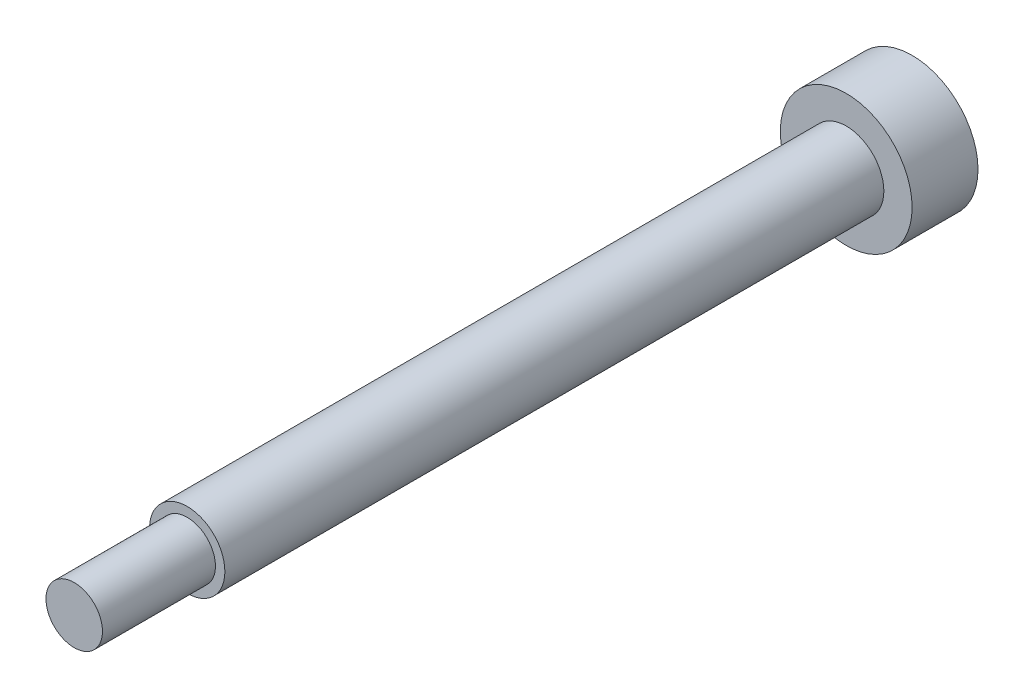
ISO-10303-21;
HEADER;
FILE_DESCRIPTION(('STEP AP214'),'2;1');
FILE_NAME('part.step','',(''),(''),'','','');
FILE_SCHEMA(('AUTOMOTIVE_DESIGN { 1 0 10303 214 1 1 1 1 }'));
ENDSEC;
DATA;
#1=APPLICATION_CONTEXT('core data for automotive mechanical design processes');
#2=APPLICATION_PROTOCOL_DEFINITION('international standard','automotive_design',2000,#1);
#3=PRODUCT_CONTEXT('',#1,'mechanical');
#4=PRODUCT('Part','Part','',(#3));
#5=PRODUCT_RELATED_PRODUCT_CATEGORY('part','',(#4));
#6=PRODUCT_DEFINITION_FORMATION('','',#4);
#7=PRODUCT_DEFINITION_CONTEXT('part definition',#1,'design');
#8=PRODUCT_DEFINITION('design','',#6,#7);
#9=PRODUCT_DEFINITION_SHAPE('','',#8);
#10=(LENGTH_UNIT() NAMED_UNIT(*) SI_UNIT(.MILLI.,.METRE.));
#11=(NAMED_UNIT(*) PLANE_ANGLE_UNIT() SI_UNIT($,.RADIAN.));
#12=(NAMED_UNIT(*) SI_UNIT($,.STERADIAN.) SOLID_ANGLE_UNIT());
#13=UNCERTAINTY_MEASURE_WITH_UNIT(LENGTH_MEASURE(1.E-05),#10,'distance_accuracy_value','');
#14=(GEOMETRIC_REPRESENTATION_CONTEXT(3) GLOBAL_UNCERTAINTY_ASSIGNED_CONTEXT((#13)) GLOBAL_UNIT_ASSIGNED_CONTEXT((#10,
#11,#12)) REPRESENTATION_CONTEXT('',''));
#15=CARTESIAN_POINT('',(0.,0.,0.));
#16=DIRECTION('',(0.,0.,1.));
#17=DIRECTION('',(1.,0.,0.));
#18=AXIS2_PLACEMENT_3D('',#15,#16,#17);
#19=CARTESIAN_POINT('',(0.,0.,-3.5));
#20=DIRECTION('',(0.,0.,1.));
#21=DIRECTION('',(-1.,0.,0.));
#22=AXIS2_PLACEMENT_3D('',#19,#20,#21);
#23=CYLINDRICAL_SURFACE('',#22,3.5);
#24=CARTESIAN_POINT('',(0.,0.,-3.5));
#25=DIRECTION('',(0.,0.,1.));
#26=DIRECTION('',(1.,0.,0.));
#27=AXIS2_PLACEMENT_3D('',#24,#25,#26);
#28=CIRCLE('',#27,3.5);
#29=CARTESIAN_POINT('',(3.5,0.,-3.5));
#30=VERTEX_POINT('',#29);
#31=EDGE_CURVE('E46',#30,#30,#28,.T.);
#32=ORIENTED_EDGE('',*,*,#31,.T.);
#33=EDGE_LOOP('',(#32));
#34=FACE_BOUND('',#33,.T.);
#35=CARTESIAN_POINT('',(0.,0.,0.));
#36=DIRECTION('',(0.,0.,1.));
#37=DIRECTION('',(1.,0.,0.));
#38=AXIS2_PLACEMENT_3D('',#35,#36,#37);
#39=CIRCLE('',#38,3.5);
#40=CARTESIAN_POINT('',(3.5,0.,0.));
#41=VERTEX_POINT('',#40);
#42=EDGE_CURVE('E129',#41,#41,#39,.T.);
#43=ORIENTED_EDGE('',*,*,#42,.F.);
#44=EDGE_LOOP('',(#43));
#45=FACE_BOUND('',#44,.T.);
#46=ADVANCED_FACE('F39',(#34,#45),#23,.T.);
#47=CARTESIAN_POINT('',(0.,0.,-3.5));
#48=DIRECTION('',(0.,0.,-1.));
#49=DIRECTION('',(1.,0.,0.));
#50=AXIS2_PLACEMENT_3D('',#47,#48,#49);
#51=PLANE('',#50);
#52=DIRECTION('',(-0.483885708586405,0.875131202178183,0.));
#53=VECTOR('',#52,1.);
#54=CARTESIAN_POINT('',(1.73175411943134,-0.0320572898511147,-3.5));
#55=LINE('',#54,#53);
#56=CARTESIAN_POINT('',(1.73175411943134,-0.0320572898511147,-3.5));
#57=VERTEX_POINT('',#56);
#58=CARTESIAN_POINT('',(0.893639487103215,1.48371441561033,-3.5));
#59=VERTEX_POINT('',#58);
#60=EDGE_CURVE('E146',#57,#59,#55,.T.);
#61=ORIENTED_EDGE('',*,*,#60,.T.);
#62=DIRECTION('',(-0.999828707023925,0.0185082849250311,0.));
#63=VECTOR('',#62,1.);
#64=CARTESIAN_POINT('',(0.893639487103215,1.48371441561033,-3.5));
#65=LINE('',#64,#63);
#66=CARTESIAN_POINT('',(-0.838114632328121,1.51577170546145,-3.5));
#67=VERTEX_POINT('',#66);
#68=EDGE_CURVE('E143',#59,#67,#65,.T.);
#69=ORIENTED_EDGE('',*,*,#68,.T.);
#70=DIRECTION('',(-0.51594299843752,-0.856622917253152,0.));
#71=VECTOR('',#70,1.);
#72=CARTESIAN_POINT('',(-0.838114632328121,1.51577170546145,-3.5));
#73=LINE('',#72,#71);
#74=CARTESIAN_POINT('',(-1.73175411943134,0.0320572898511147,-3.5));
#75=VERTEX_POINT('',#74);
#76=EDGE_CURVE('E140',#67,#75,#73,.T.);
#77=ORIENTED_EDGE('',*,*,#76,.T.);
#78=DIRECTION('',(0.483885708586405,-0.875131202178183,0.));
#79=VECTOR('',#78,1.);
#80=CARTESIAN_POINT('',(-1.73175411943134,0.0320572898511147,-3.5));
#81=LINE('',#80,#79);
#82=CARTESIAN_POINT('',(-0.893639487103214,-1.48371441561033,-3.5));
#83=VERTEX_POINT('',#82);
#84=EDGE_CURVE('E138',#75,#83,#81,.T.);
#85=ORIENTED_EDGE('',*,*,#84,.T.);
#86=DIRECTION('',(0.999828707023925,-0.0185082849250311,0.));
#87=VECTOR('',#86,1.);
#88=CARTESIAN_POINT('',(-0.893639487103214,-1.48371441561033,-3.5));
#89=LINE('',#88,#87);
#90=CARTESIAN_POINT('',(0.838114632328121,-1.51577170546145,-3.5));
#91=VERTEX_POINT('',#90);
#92=EDGE_CURVE('E117',#83,#91,#89,.T.);
#93=ORIENTED_EDGE('',*,*,#92,.T.);
#94=DIRECTION('',(0.51594299843752,0.856622917253152,0.));
#95=VECTOR('',#94,1.);
#96=CARTESIAN_POINT('',(0.838114632328121,-1.51577170546145,-3.5));
#97=LINE('',#96,#95);
#98=EDGE_CURVE('E134',#91,#57,#97,.T.);
#99=ORIENTED_EDGE('',*,*,#98,.T.);
#100=EDGE_LOOP('',(#61,#69,#77,#85,#93,#99));
#101=FACE_BOUND('',#100,.T.);
#102=ORIENTED_EDGE('',*,*,#31,.F.);
#103=EDGE_LOOP('',(#102));
#104=FACE_BOUND('',#103,.T.);
#105=ADVANCED_FACE('F175',(#101,#104),#51,.T.);
#106=CARTESIAN_POINT('',(0.,0.,0.));
#107=DIRECTION('',(0.,0.,-1.));
#108=DIRECTION('',(1.,0.,0.));
#109=AXIS2_PLACEMENT_3D('',#106,#107,#108);
#110=PLANE('',#109);
#111=CARTESIAN_POINT('',(0.,0.,0.));
#112=DIRECTION('',(0.,0.,1.));
#113=DIRECTION('',(1.,0.,0.));
#114=AXIS2_PLACEMENT_3D('',#111,#112,#113);
#115=CIRCLE('',#114,2.);
#116=CARTESIAN_POINT('',(2.,0.,0.));
#117=VERTEX_POINT('',#116);
#118=EDGE_CURVE('E11',#117,#117,#115,.F.);
#119=ORIENTED_EDGE('',*,*,#118,.T.);
#120=EDGE_LOOP('',(#119));
#121=FACE_BOUND('',#120,.T.);
#122=ORIENTED_EDGE('',*,*,#42,.T.);
#123=EDGE_LOOP('',(#122));
#124=FACE_BOUND('',#123,.T.);
#125=ADVANCED_FACE('F180',(#121,#124),#110,.F.);
#126=CARTESIAN_POINT('',(1.73175411943134,-0.0320572898511147,-1.5));
#127=DIRECTION('',(0.875131202178183,0.483885708586405,0.));
#128=DIRECTION('',(-0.483885708586405,0.875131202178183,0.));
#129=AXIS2_PLACEMENT_3D('',#126,#127,#128);
#130=PLANE('',#129);
#131=ORIENTED_EDGE('',*,*,#60,.F.);
#132=DIRECTION('',(0.,0.,-1.));
#133=VECTOR('',#132,1.);
#134=CARTESIAN_POINT('',(1.73175411943134,-0.0320572898511147,-1.5));
#135=LINE('',#134,#133);
#136=CARTESIAN_POINT('',(1.73175411943134,-0.0320572898511147,-1.5));
#137=VERTEX_POINT('',#136);
#138=EDGE_CURVE('E84',#137,#57,#135,.T.);
#139=ORIENTED_EDGE('',*,*,#138,.F.);
#140=DIRECTION('',(-0.483885708586405,0.875131202178183,0.));
#141=VECTOR('',#140,1.);
#142=CARTESIAN_POINT('',(1.73175411943134,-0.0320572898511147,-1.5));
#143=LINE('',#142,#141);
#144=CARTESIAN_POINT('',(0.893639487103215,1.48371441561033,-1.5));
#145=VERTEX_POINT('',#144);
#146=EDGE_CURVE('E136',#137,#145,#143,.T.);
#147=ORIENTED_EDGE('',*,*,#146,.T.);
#148=DIRECTION('',(0.,0.,-1.));
#149=VECTOR('',#148,1.);
#150=CARTESIAN_POINT('',(0.893639487103215,1.48371441561033,-1.5));
#151=LINE('',#150,#149);
#152=EDGE_CURVE('E53',#145,#59,#151,.T.);
#153=ORIENTED_EDGE('',*,*,#152,.T.);
#154=EDGE_LOOP('',(#131,#139,#147,#153));
#155=FACE_BOUND('',#154,.T.);
#156=ADVANCED_FACE('F189',(#155),#130,.F.);
#157=CARTESIAN_POINT('',(0.838114632328121,-1.51577170546145,-1.5));
#158=DIRECTION('',(0.856622917253152,-0.51594299843752,0.));
#159=DIRECTION('',(0.51594299843752,0.856622917253153,0.));
#160=AXIS2_PLACEMENT_3D('',#157,#158,#159);
#161=PLANE('',#160);
#162=ORIENTED_EDGE('',*,*,#98,.F.);
#163=DIRECTION('',(0.,0.,-1.));
#164=VECTOR('',#163,1.);
#165=CARTESIAN_POINT('',(0.838114632328121,-1.51577170546145,-1.5));
#166=LINE('',#165,#164);
#167=CARTESIAN_POINT('',(0.838114632328121,-1.51577170546145,-1.5));
#168=VERTEX_POINT('',#167);
#169=EDGE_CURVE('E119',#168,#91,#166,.T.);
#170=ORIENTED_EDGE('',*,*,#169,.F.);
#171=DIRECTION('',(0.51594299843752,0.856622917253152,0.));
#172=VECTOR('',#171,1.);
#173=CARTESIAN_POINT('',(0.838114632328121,-1.51577170546145,-1.5));
#174=LINE('',#173,#172);
#175=EDGE_CURVE('E62',#168,#137,#174,.T.);
#176=ORIENTED_EDGE('',*,*,#175,.T.);
#177=ORIENTED_EDGE('',*,*,#138,.T.);
#178=EDGE_LOOP('',(#162,#170,#176,#177));
#179=FACE_BOUND('',#178,.T.);
#180=ADVANCED_FACE('F194',(#179),#161,.F.);
#181=CARTESIAN_POINT('',(-0.893639487103214,-1.48371441561033,-1.5));
#182=DIRECTION('',(-0.0185082849250311,-0.999828707023925,0.));
#183=DIRECTION('',(0.999828707023925,-0.0185082849250311,0.));
#184=AXIS2_PLACEMENT_3D('',#181,#182,#183);
#185=PLANE('',#184);
#186=ORIENTED_EDGE('',*,*,#92,.F.);
#187=DIRECTION('',(0.,0.,-1.));
#188=VECTOR('',#187,1.);
#189=CARTESIAN_POINT('',(-0.893639487103214,-1.48371441561033,-1.5));
#190=LINE('',#189,#188);
#191=CARTESIAN_POINT('',(-0.893639487103214,-1.48371441561033,-1.5));
#192=VERTEX_POINT('',#191);
#193=EDGE_CURVE('E106',#192,#83,#190,.T.);
#194=ORIENTED_EDGE('',*,*,#193,.F.);
#195=DIRECTION('',(0.999828707023925,-0.0185082849250311,0.));
#196=VECTOR('',#195,1.);
#197=CARTESIAN_POINT('',(-0.893639487103214,-1.48371441561033,-1.5));
#198=LINE('',#197,#196);
#199=EDGE_CURVE('E109',#192,#168,#198,.T.);
#200=ORIENTED_EDGE('',*,*,#199,.T.);
#201=ORIENTED_EDGE('',*,*,#169,.T.);
#202=EDGE_LOOP('',(#186,#194,#200,#201));
#203=FACE_BOUND('',#202,.T.);
#204=ADVANCED_FACE('F115',(#203),#185,.F.);
#205=CARTESIAN_POINT('',(-1.73175411943134,0.0320572898511147,-1.5));
#206=DIRECTION('',(-0.875131202178183,-0.483885708586405,0.));
#207=DIRECTION('',(0.483885708586405,-0.875131202178183,0.));
#208=AXIS2_PLACEMENT_3D('',#205,#206,#207);
#209=PLANE('',#208);
#210=ORIENTED_EDGE('',*,*,#84,.F.);
#211=DIRECTION('',(0.,0.,-1.));
#212=VECTOR('',#211,1.);
#213=CARTESIAN_POINT('',(-1.73175411943134,0.0320572898511147,-1.5));
#214=LINE('',#213,#212);
#215=CARTESIAN_POINT('',(-1.73175411943134,0.0320572898511147,-1.5));
#216=VERTEX_POINT('',#215);
#217=EDGE_CURVE('E108',#216,#75,#214,.T.);
#218=ORIENTED_EDGE('',*,*,#217,.F.);
#219=DIRECTION('',(0.483885708586405,-0.875131202178183,0.));
#220=VECTOR('',#219,1.);
#221=CARTESIAN_POINT('',(-1.73175411943134,0.0320572898511147,-1.5));
#222=LINE('',#221,#220);
#223=EDGE_CURVE('E101',#216,#192,#222,.T.);
#224=ORIENTED_EDGE('',*,*,#223,.T.);
#225=ORIENTED_EDGE('',*,*,#193,.T.);
#226=EDGE_LOOP('',(#210,#218,#224,#225));
#227=FACE_BOUND('',#226,.T.);
#228=ADVANCED_FACE('F104',(#227),#209,.F.);
#229=CARTESIAN_POINT('',(-0.838114632328121,1.51577170546145,-1.5));
#230=DIRECTION('',(-0.856622917253152,0.51594299843752,0.));
#231=DIRECTION('',(-0.51594299843752,-0.856622917253153,0.));
#232=AXIS2_PLACEMENT_3D('',#229,#230,#231);
#233=PLANE('',#232);
#234=ORIENTED_EDGE('',*,*,#76,.F.);
#235=DIRECTION('',(0.,0.,-1.));
#236=VECTOR('',#235,1.);
#237=CARTESIAN_POINT('',(-0.838114632328121,1.51577170546145,-1.5));
#238=LINE('',#237,#236);
#239=CARTESIAN_POINT('',(-0.838114632328121,1.51577170546145,-1.5));
#240=VERTEX_POINT('',#239);
#241=EDGE_CURVE('E122',#240,#67,#238,.T.);
#242=ORIENTED_EDGE('',*,*,#241,.F.);
#243=DIRECTION('',(-0.51594299843752,-0.856622917253152,0.));
#244=VECTOR('',#243,1.);
#245=CARTESIAN_POINT('',(-0.838114632328121,1.51577170546145,-1.5));
#246=LINE('',#245,#244);
#247=EDGE_CURVE('E110',#240,#216,#246,.T.);
#248=ORIENTED_EDGE('',*,*,#247,.T.);
#249=ORIENTED_EDGE('',*,*,#217,.T.);
#250=EDGE_LOOP('',(#234,#242,#248,#249));
#251=FACE_BOUND('',#250,.T.);
#252=ADVANCED_FACE('F198',(#251),#233,.F.);
#253=CARTESIAN_POINT('',(0.893639487103215,1.48371441561033,-1.5));
#254=DIRECTION('',(0.0185082849250311,0.999828707023925,0.));
#255=DIRECTION('',(-0.999828707023925,0.0185082849250311,0.));
#256=AXIS2_PLACEMENT_3D('',#253,#254,#255);
#257=PLANE('',#256);
#258=ORIENTED_EDGE('',*,*,#68,.F.);
#259=ORIENTED_EDGE('',*,*,#152,.F.);
#260=DIRECTION('',(-0.999828707023925,0.0185082849250311,0.));
#261=VECTOR('',#260,1.);
#262=CARTESIAN_POINT('',(0.893639487103215,1.48371441561033,-1.5));
#263=LINE('',#262,#261);
#264=EDGE_CURVE('E92',#145,#240,#263,.T.);
#265=ORIENTED_EDGE('',*,*,#264,.T.);
#266=ORIENTED_EDGE('',*,*,#241,.T.);
#267=EDGE_LOOP('',(#258,#259,#265,#266));
#268=FACE_BOUND('',#267,.T.);
#269=ADVANCED_FACE('F195',(#268),#257,.F.);
#270=CARTESIAN_POINT('',(0.,0.,-1.5));
#271=DIRECTION('',(0.,0.,-1.));
#272=DIRECTION('',(1.,0.,0.));
#273=AXIS2_PLACEMENT_3D('',#270,#271,#272);
#274=PLANE('',#273);
#275=ORIENTED_EDGE('',*,*,#146,.F.);
#276=ORIENTED_EDGE('',*,*,#175,.F.);
#277=ORIENTED_EDGE('',*,*,#199,.F.);
#278=ORIENTED_EDGE('',*,*,#223,.F.);
#279=ORIENTED_EDGE('',*,*,#247,.F.);
#280=ORIENTED_EDGE('',*,*,#264,.F.);
#281=EDGE_LOOP('',(#275,#276,#277,#278,#279,#280));
#282=FACE_BOUND('',#281,.T.);
#283=ADVANCED_FACE('F112',(#282),#274,.T.);
#284=CARTESIAN_POINT('',(0.,0.,35.));
#285=DIRECTION('',(0.,0.,-1.));
#286=DIRECTION('',(1.,0.,0.));
#287=AXIS2_PLACEMENT_3D('',#284,#285,#286);
#288=CYLINDRICAL_SURFACE('',#287,2.);
#289=CARTESIAN_POINT('',(0.,0.,35.));
#290=DIRECTION('',(0.,0.,-1.));
#291=DIRECTION('',(-1.,0.,0.));
#292=AXIS2_PLACEMENT_3D('',#289,#290,#291);
#293=CIRCLE('',#292,2.);
#294=CARTESIAN_POINT('',(-2.,0.,35.));
#295=VERTEX_POINT('',#294);
#296=EDGE_CURVE('E149',#295,#295,#293,.T.);
#297=ORIENTED_EDGE('',*,*,#296,.T.);
#298=EDGE_LOOP('',(#297));
#299=FACE_BOUND('',#298,.T.);
#300=ORIENTED_EDGE('',*,*,#118,.F.);
#301=EDGE_LOOP('',(#300));
#302=FACE_BOUND('',#301,.T.);
#303=ADVANCED_FACE('F211',(#299,#302),#288,.T.);
#304=CARTESIAN_POINT('',(0.,0.,35.));
#305=DIRECTION('',(0.,0.,1.));
#306=DIRECTION('',(-1.,0.,0.));
#307=AXIS2_PLACEMENT_3D('',#304,#305,#306);
#308=PLANE('',#307);
#309=CARTESIAN_POINT('',(0.,0.,35.));
#310=DIRECTION('',(0.,0.,-1.));
#311=DIRECTION('',(-1.,0.,0.));
#312=AXIS2_PLACEMENT_3D('',#309,#310,#311);
#313=CIRCLE('',#312,1.5);
#314=CARTESIAN_POINT('',(-1.5,0.,35.));
#315=VERTEX_POINT('',#314);
#316=EDGE_CURVE('E157',#315,#315,#313,.T.);
#317=ORIENTED_EDGE('',*,*,#316,.T.);
#318=EDGE_LOOP('',(#317));
#319=FACE_BOUND('',#318,.T.);
#320=ORIENTED_EDGE('',*,*,#296,.F.);
#321=EDGE_LOOP('',(#320));
#322=FACE_BOUND('',#321,.T.);
#323=ADVANCED_FACE('F172',(#319,#322),#308,.T.);
#324=CARTESIAN_POINT('',(0.,0.,41.));
#325=DIRECTION('',(0.,0.,-1.));
#326=DIRECTION('',(1.,0.,0.));
#327=AXIS2_PLACEMENT_3D('',#324,#325,#326);
#328=CYLINDRICAL_SURFACE('',#327,1.5);
#329=CARTESIAN_POINT('',(0.,0.,41.));
#330=DIRECTION('',(0.,0.,-1.));
#331=DIRECTION('',(-1.,0.,0.));
#332=AXIS2_PLACEMENT_3D('',#329,#330,#331);
#333=CIRCLE('',#332,1.5);
#334=CARTESIAN_POINT('',(-1.5,0.,41.));
#335=VERTEX_POINT('',#334);
#336=EDGE_CURVE('E156',#335,#335,#333,.T.);
#337=ORIENTED_EDGE('',*,*,#336,.T.);
#338=EDGE_LOOP('',(#337));
#339=FACE_BOUND('',#338,.T.);
#340=ORIENTED_EDGE('',*,*,#316,.F.);
#341=EDGE_LOOP('',(#340));
#342=FACE_BOUND('',#341,.T.);
#343=ADVANCED_FACE('F163',(#339,#342),#328,.T.);
#344=CARTESIAN_POINT('',(0.,0.,41.));
#345=DIRECTION('',(0.,0.,1.));
#346=DIRECTION('',(-1.,0.,0.));
#347=AXIS2_PLACEMENT_3D('',#344,#345,#346);
#348=PLANE('',#347);
#349=ORIENTED_EDGE('',*,*,#336,.F.);
#350=EDGE_LOOP('',(#349));
#351=FACE_BOUND('',#350,.T.);
#352=ADVANCED_FACE('F166',(#351),#348,.T.);
#353=CLOSED_SHELL('',(#46,#105,#125,#156,#180,#204,#228,#252,#269,#283,#303,#323,#343,#352));
#354=MANIFOLD_SOLID_BREP('B2',#353);
#355=ADVANCED_BREP_SHAPE_REPRESENTATION('',(#18,#354),#14);
#356=SHAPE_DEFINITION_REPRESENTATION(#9,#355);
ENDSEC;
END-ISO-10303-21;
